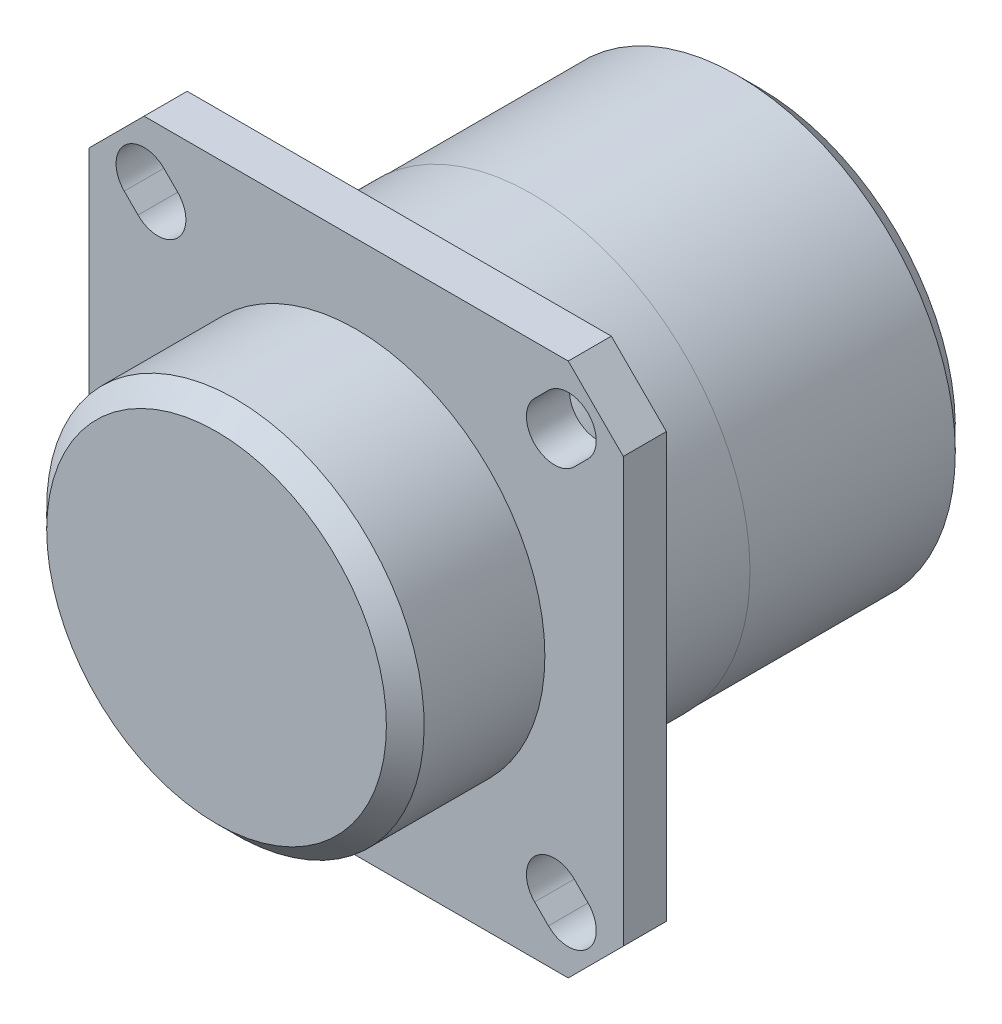
ISO-10303-21;
HEADER;
FILE_DESCRIPTION(('STEP AP214'),'2;1');
FILE_NAME('part.step','',(''),(''),'','','');
FILE_SCHEMA(('AUTOMOTIVE_DESIGN { 1 0 10303 214 1 1 1 1 }'));
ENDSEC;
DATA;
#1=APPLICATION_CONTEXT('core data for automotive mechanical design processes');
#2=APPLICATION_PROTOCOL_DEFINITION('international standard','automotive_design',2000,#1);
#3=PRODUCT_CONTEXT('',#1,'mechanical');
#4=PRODUCT('Part','Part','',(#3));
#5=PRODUCT_RELATED_PRODUCT_CATEGORY('part','',(#4));
#6=PRODUCT_DEFINITION_FORMATION('','',#4);
#7=PRODUCT_DEFINITION_CONTEXT('part definition',#1,'design');
#8=PRODUCT_DEFINITION('design','',#6,#7);
#9=PRODUCT_DEFINITION_SHAPE('','',#8);
#10=(LENGTH_UNIT() NAMED_UNIT(*) SI_UNIT(.MILLI.,.METRE.));
#11=(NAMED_UNIT(*) PLANE_ANGLE_UNIT() SI_UNIT($,.RADIAN.));
#12=(NAMED_UNIT(*) SI_UNIT($,.STERADIAN.) SOLID_ANGLE_UNIT());
#13=UNCERTAINTY_MEASURE_WITH_UNIT(LENGTH_MEASURE(1.E-05),#10,'distance_accuracy_value','');
#14=(GEOMETRIC_REPRESENTATION_CONTEXT(3) GLOBAL_UNCERTAINTY_ASSIGNED_CONTEXT((#13)) GLOBAL_UNIT_ASSIGNED_CONTEXT((#10,
#11,#12)) REPRESENTATION_CONTEXT('',''));
#15=CARTESIAN_POINT('',(0.,0.,0.));
#16=DIRECTION('',(0.,0.,1.));
#17=DIRECTION('',(1.,0.,0.));
#18=AXIS2_PLACEMENT_3D('',#15,#16,#17);
#19=CARTESIAN_POINT('',(0.,0.,0.));
#20=DIRECTION('',(0.,0.,1.));
#21=DIRECTION('',(1.,0.,0.));
#22=AXIS2_PLACEMENT_3D('',#19,#20,#21);
#23=PLANE('',#22);
#24=DIRECTION('',(-0.707106781186548,0.707106781186548,0.));
#25=VECTOR('',#24,1.);
#26=CARTESIAN_POINT('',(-12.305,-15.5,0.));
#27=LINE('',#26,#25);
#28=CARTESIAN_POINT('',(-12.305,-15.5,0.));
#29=VERTEX_POINT('',#28);
#30=CARTESIAN_POINT('',(-15.5,-12.305,0.));
#31=VERTEX_POINT('',#30);
#32=EDGE_CURVE('E9',#29,#31,#27,.T.);
#33=ORIENTED_EDGE('',*,*,#32,.T.);
#34=DIRECTION('',(0.,1.,0.));
#35=VECTOR('',#34,1.);
#36=CARTESIAN_POINT('',(-15.5,-12.305,0.));
#37=LINE('',#36,#35);
#38=CARTESIAN_POINT('',(-15.5,12.305,0.));
#39=VERTEX_POINT('',#38);
#40=EDGE_CURVE('E394',#31,#39,#37,.T.);
#41=ORIENTED_EDGE('',*,*,#40,.T.);
#42=DIRECTION('',(0.707106781186548,0.707106781186548,0.));
#43=VECTOR('',#42,1.);
#44=CARTESIAN_POINT('',(-15.5,12.305,0.));
#45=LINE('',#44,#43);
#46=CARTESIAN_POINT('',(-12.305,15.5,0.));
#47=VERTEX_POINT('',#46);
#48=EDGE_CURVE('E271',#39,#47,#45,.T.);
#49=ORIENTED_EDGE('',*,*,#48,.T.);
#50=DIRECTION('',(1.,0.,0.));
#51=VECTOR('',#50,1.);
#52=CARTESIAN_POINT('',(-12.305,15.5,0.));
#53=LINE('',#52,#51);
#54=CARTESIAN_POINT('',(12.305,15.5,0.));
#55=VERTEX_POINT('',#54);
#56=EDGE_CURVE('E258',#47,#55,#53,.T.);
#57=ORIENTED_EDGE('',*,*,#56,.T.);
#58=DIRECTION('',(0.707106781186548,-0.707106781186548,0.));
#59=VECTOR('',#58,1.);
#60=CARTESIAN_POINT('',(12.305,15.5,0.));
#61=LINE('',#60,#59);
#62=CARTESIAN_POINT('',(15.5,12.305,0.));
#63=VERTEX_POINT('',#62);
#64=EDGE_CURVE('E273',#55,#63,#61,.T.);
#65=ORIENTED_EDGE('',*,*,#64,.T.);
#66=DIRECTION('',(0.,-1.,0.));
#67=VECTOR('',#66,1.);
#68=CARTESIAN_POINT('',(15.5,12.305,0.));
#69=LINE('',#68,#67);
#70=CARTESIAN_POINT('',(15.5,-12.305,0.));
#71=VERTEX_POINT('',#70);
#72=EDGE_CURVE('E309',#63,#71,#69,.T.);
#73=ORIENTED_EDGE('',*,*,#72,.T.);
#74=DIRECTION('',(-0.707106781186548,-0.707106781186548,0.));
#75=VECTOR('',#74,1.);
#76=CARTESIAN_POINT('',(15.5,-12.305,0.));
#77=LINE('',#76,#75);
#78=CARTESIAN_POINT('',(12.305,-15.5,0.));
#79=VERTEX_POINT('',#78);
#80=EDGE_CURVE('E263',#71,#79,#77,.T.);
#81=ORIENTED_EDGE('',*,*,#80,.T.);
#82=DIRECTION('',(-1.,0.,0.));
#83=VECTOR('',#82,1.);
#84=CARTESIAN_POINT('',(12.305,-15.5,0.));
#85=LINE('',#84,#83);
#86=EDGE_CURVE('E288',#79,#29,#85,.T.);
#87=ORIENTED_EDGE('',*,*,#86,.T.);
#88=EDGE_LOOP('',(#33,#41,#49,#57,#65,#73,#81,#87));
#89=FACE_BOUND('',#88,.T.);
#90=DIRECTION('',(-0.707106781186548,-0.707106781186548,0.));
#91=VECTOR('',#90,1.);
#92=CARTESIAN_POINT('',(4.80345148057186,7.10154851942814,0.));
#93=LINE('',#92,#91);
#94=CARTESIAN_POINT('',(11.1559514805719,13.4540485194281,0.));
#95=VERTEX_POINT('',#94);
#96=CARTESIAN_POINT('',(10.3559514805719,12.6540485194281,0.));
#97=VERTEX_POINT('',#96);
#98=EDGE_CURVE('E221',#95,#97,#93,.T.);
#99=ORIENTED_EDGE('',*,*,#98,.T.);
#100=CARTESIAN_POINT('',(11.505,11.505,0.));
#101=DIRECTION('',(0.,0.,1.));
#102=DIRECTION('',(1.,0.,0.));
#103=AXIS2_PLACEMENT_3D('',#100,#101,#102);
#104=CIRCLE('',#103,1.625);
#105=CARTESIAN_POINT('',(12.6540485194281,10.3559514805719,0.));
#106=VERTEX_POINT('',#105);
#107=EDGE_CURVE('E229',#97,#106,#104,.T.);
#108=ORIENTED_EDGE('',*,*,#107,.T.);
#109=DIRECTION('',(0.707106781186548,0.707106781186548,0.));
#110=VECTOR('',#109,1.);
#111=CARTESIAN_POINT('',(7.10154851942814,4.80345148057186,0.));
#112=LINE('',#111,#110);
#113=CARTESIAN_POINT('',(13.4540485194281,11.1559514805719,0.));
#114=VERTEX_POINT('',#113);
#115=EDGE_CURVE('E295',#106,#114,#112,.T.);
#116=ORIENTED_EDGE('',*,*,#115,.T.);
#117=CARTESIAN_POINT('',(12.305,12.305,0.));
#118=DIRECTION('',(0.,0.,1.));
#119=DIRECTION('',(1.,0.,0.));
#120=AXIS2_PLACEMENT_3D('',#117,#118,#119);
#121=CIRCLE('',#120,1.625);
#122=EDGE_CURVE('E213',#114,#95,#121,.T.);
#123=ORIENTED_EDGE('',*,*,#122,.T.);
#124=EDGE_LOOP('',(#99,#108,#116,#123));
#125=FACE_BOUND('',#124,.T.);
#126=DIRECTION('',(0.707106781186548,-0.707106781186548,0.));
#127=VECTOR('',#126,1.);
#128=CARTESIAN_POINT('',(-7.10154851942814,4.80345148057186,0.));
#129=LINE('',#128,#127);
#130=CARTESIAN_POINT('',(-13.4540485194281,11.1559514805719,0.));
#131=VERTEX_POINT('',#130);
#132=CARTESIAN_POINT('',(-12.6540485194281,10.3559514805719,0.));
#133=VERTEX_POINT('',#132);
#134=EDGE_CURVE('E343',#131,#133,#129,.T.);
#135=ORIENTED_EDGE('',*,*,#134,.T.);
#136=CARTESIAN_POINT('',(-11.505,11.505,0.));
#137=DIRECTION('',(0.,0.,1.));
#138=DIRECTION('',(0.,1.,0.));
#139=AXIS2_PLACEMENT_3D('',#136,#137,#138);
#140=CIRCLE('',#139,1.625);
#141=CARTESIAN_POINT('',(-10.3559514805719,12.6540485194281,0.));
#142=VERTEX_POINT('',#141);
#143=EDGE_CURVE('E243',#133,#142,#140,.T.);
#144=ORIENTED_EDGE('',*,*,#143,.T.);
#145=DIRECTION('',(-0.707106781186548,0.707106781186548,0.));
#146=VECTOR('',#145,1.);
#147=CARTESIAN_POINT('',(-4.80345148057186,7.10154851942814,0.));
#148=LINE('',#147,#146);
#149=CARTESIAN_POINT('',(-11.1559514805719,13.4540485194281,0.));
#150=VERTEX_POINT('',#149);
#151=EDGE_CURVE('E235',#142,#150,#148,.T.);
#152=ORIENTED_EDGE('',*,*,#151,.T.);
#153=CARTESIAN_POINT('',(-12.305,12.305,0.));
#154=DIRECTION('',(0.,0.,1.));
#155=DIRECTION('',(0.,1.,0.));
#156=AXIS2_PLACEMENT_3D('',#153,#154,#155);
#157=CIRCLE('',#156,1.625);
#158=EDGE_CURVE('E323',#150,#131,#157,.T.);
#159=ORIENTED_EDGE('',*,*,#158,.T.);
#160=EDGE_LOOP('',(#135,#144,#152,#159));
#161=FACE_BOUND('',#160,.T.);
#162=DIRECTION('',(0.707106781186548,0.707106781186548,0.));
#163=VECTOR('',#162,1.);
#164=CARTESIAN_POINT('',(-4.80345148057186,-7.10154851942814,0.));
#165=LINE('',#164,#163);
#166=CARTESIAN_POINT('',(-11.1559514805719,-13.4540485194281,0.));
#167=VERTEX_POINT('',#166);
#168=CARTESIAN_POINT('',(-10.3559514805719,-12.6540485194281,0.));
#169=VERTEX_POINT('',#168);
#170=EDGE_CURVE('E290',#167,#169,#165,.T.);
#171=ORIENTED_EDGE('',*,*,#170,.T.);
#172=CARTESIAN_POINT('',(-11.505,-11.505,0.));
#173=DIRECTION('',(0.,0.,1.));
#174=DIRECTION('',(-1.,0.,0.));
#175=AXIS2_PLACEMENT_3D('',#172,#173,#174);
#176=CIRCLE('',#175,1.625);
#177=CARTESIAN_POINT('',(-12.6540485194281,-10.3559514805719,0.));
#178=VERTEX_POINT('',#177);
#179=EDGE_CURVE('E320',#169,#178,#176,.T.);
#180=ORIENTED_EDGE('',*,*,#179,.T.);
#181=DIRECTION('',(-0.707106781186548,-0.707106781186547,0.));
#182=VECTOR('',#181,1.);
#183=CARTESIAN_POINT('',(-7.10154851942814,-4.80345148057186,0.));
#184=LINE('',#183,#182);
#185=CARTESIAN_POINT('',(-13.4540485194281,-11.1559514805719,0.));
#186=VERTEX_POINT('',#185);
#187=EDGE_CURVE('E280',#178,#186,#184,.T.);
#188=ORIENTED_EDGE('',*,*,#187,.T.);
#189=CARTESIAN_POINT('',(-12.305,-12.305,0.));
#190=DIRECTION('',(0.,0.,1.));
#191=DIRECTION('',(-1.,0.,0.));
#192=AXIS2_PLACEMENT_3D('',#189,#190,#191);
#193=CIRCLE('',#192,1.625);
#194=EDGE_CURVE('E19',#186,#167,#193,.T.);
#195=ORIENTED_EDGE('',*,*,#194,.T.);
#196=EDGE_LOOP('',(#171,#180,#188,#195));
#197=FACE_BOUND('',#196,.T.);
#198=DIRECTION('',(-0.707106781186548,0.707106781186548,0.));
#199=VECTOR('',#198,1.);
#200=CARTESIAN_POINT('',(7.10154851942814,-4.80345148057186,0.));
#201=LINE('',#200,#199);
#202=CARTESIAN_POINT('',(13.4540485194281,-11.1559514805719,0.));
#203=VERTEX_POINT('',#202);
#204=CARTESIAN_POINT('',(12.6540485194281,-10.3559514805719,0.));
#205=VERTEX_POINT('',#204);
#206=EDGE_CURVE('E371',#203,#205,#201,.T.);
#207=ORIENTED_EDGE('',*,*,#206,.T.);
#208=CARTESIAN_POINT('',(11.505,-11.505,0.));
#209=DIRECTION('',(0.,0.,1.));
#210=DIRECTION('',(0.,-1.,0.));
#211=AXIS2_PLACEMENT_3D('',#208,#209,#210);
#212=CIRCLE('',#211,1.625);
#213=CARTESIAN_POINT('',(10.3559514805719,-12.6540485194281,0.));
#214=VERTEX_POINT('',#213);
#215=EDGE_CURVE('E251',#205,#214,#212,.T.);
#216=ORIENTED_EDGE('',*,*,#215,.T.);
#217=DIRECTION('',(0.707106781186547,-0.707106781186548,0.));
#218=VECTOR('',#217,1.);
#219=CARTESIAN_POINT('',(4.80345148057186,-7.10154851942814,0.));
#220=LINE('',#219,#218);
#221=CARTESIAN_POINT('',(11.1559514805719,-13.4540485194281,0.));
#222=VERTEX_POINT('',#221);
#223=EDGE_CURVE('E327',#214,#222,#220,.T.);
#224=ORIENTED_EDGE('',*,*,#223,.T.);
#225=CARTESIAN_POINT('',(12.305,-12.305,0.));
#226=DIRECTION('',(0.,0.,1.));
#227=DIRECTION('',(0.,-1.,0.));
#228=AXIS2_PLACEMENT_3D('',#225,#226,#227);
#229=CIRCLE('',#228,1.625);
#230=EDGE_CURVE('E333',#222,#203,#229,.T.);
#231=ORIENTED_EDGE('',*,*,#230,.T.);
#232=EDGE_LOOP('',(#207,#216,#224,#231));
#233=FACE_BOUND('',#232,.T.);
#234=CARTESIAN_POINT('',(0.,0.,0.));
#235=DIRECTION('',(0.,0.,1.));
#236=DIRECTION('',(0.,1.,0.));
#237=AXIS2_PLACEMENT_3D('',#234,#235,#236);
#238=CIRCLE('',#237,12.65025);
#239=CARTESIAN_POINT('',(0.,-12.65025,0.));
#240=VERTEX_POINT('',#239);
#241=EDGE_CURVE('E304',#240,#240,#238,.T.);
#242=ORIENTED_EDGE('',*,*,#241,.T.);
#243=EDGE_LOOP('',(#242));
#244=FACE_BOUND('',#243,.T.);
#245=ADVANCED_FACE('F15',(#89,#125,#161,#197,#233,#244),#23,.F.);
#246=CARTESIAN_POINT('',(0.,0.,2.5));
#247=DIRECTION('',(0.,0.,1.));
#248=DIRECTION('',(1.,0.,0.));
#249=AXIS2_PLACEMENT_3D('',#246,#247,#248);
#250=PLANE('',#249);
#251=DIRECTION('',(0.,1.,0.));
#252=VECTOR('',#251,1.);
#253=CARTESIAN_POINT('',(-15.5,-12.305,2.5));
#254=LINE('',#253,#252);
#255=CARTESIAN_POINT('',(-15.5,-12.305,2.5));
#256=VERTEX_POINT('',#255);
#257=CARTESIAN_POINT('',(-15.5,12.305,2.5));
#258=VERTEX_POINT('',#257);
#259=EDGE_CURVE('E286',#256,#258,#254,.T.);
#260=ORIENTED_EDGE('',*,*,#259,.F.);
#261=DIRECTION('',(-0.707106781186548,0.707106781186548,0.));
#262=VECTOR('',#261,1.);
#263=CARTESIAN_POINT('',(-12.305,-15.5,2.5));
#264=LINE('',#263,#262);
#265=CARTESIAN_POINT('',(-12.305,-15.5,2.5));
#266=VERTEX_POINT('',#265);
#267=EDGE_CURVE('E25',#266,#256,#264,.T.);
#268=ORIENTED_EDGE('',*,*,#267,.F.);
#269=DIRECTION('',(-1.,0.,0.));
#270=VECTOR('',#269,1.);
#271=CARTESIAN_POINT('',(12.305,-15.5,2.5));
#272=LINE('',#271,#270);
#273=CARTESIAN_POINT('',(12.305,-15.5,2.5));
#274=VERTEX_POINT('',#273);
#275=EDGE_CURVE('E266',#274,#266,#272,.T.);
#276=ORIENTED_EDGE('',*,*,#275,.F.);
#277=DIRECTION('',(-0.707106781186548,-0.707106781186548,0.));
#278=VECTOR('',#277,1.);
#279=CARTESIAN_POINT('',(15.5,-12.305,2.5));
#280=LINE('',#279,#278);
#281=CARTESIAN_POINT('',(15.5,-12.305,2.5));
#282=VERTEX_POINT('',#281);
#283=EDGE_CURVE('E306',#282,#274,#280,.T.);
#284=ORIENTED_EDGE('',*,*,#283,.F.);
#285=DIRECTION('',(0.,-1.,0.));
#286=VECTOR('',#285,1.);
#287=CARTESIAN_POINT('',(15.5,12.305,2.5));
#288=LINE('',#287,#286);
#289=CARTESIAN_POINT('',(15.5,12.305,2.5));
#290=VERTEX_POINT('',#289);
#291=EDGE_CURVE('E276',#290,#282,#288,.T.);
#292=ORIENTED_EDGE('',*,*,#291,.F.);
#293=DIRECTION('',(0.707106781186548,-0.707106781186548,0.));
#294=VECTOR('',#293,1.);
#295=CARTESIAN_POINT('',(12.305,15.5,2.5));
#296=LINE('',#295,#294);
#297=CARTESIAN_POINT('',(12.305,15.5,2.5));
#298=VERTEX_POINT('',#297);
#299=EDGE_CURVE('E262',#298,#290,#296,.T.);
#300=ORIENTED_EDGE('',*,*,#299,.F.);
#301=DIRECTION('',(1.,0.,0.));
#302=VECTOR('',#301,1.);
#303=CARTESIAN_POINT('',(-12.305,15.5,2.5));
#304=LINE('',#303,#302);
#305=CARTESIAN_POINT('',(-12.305,15.5,2.5));
#306=VERTEX_POINT('',#305);
#307=EDGE_CURVE('E259',#306,#298,#304,.T.);
#308=ORIENTED_EDGE('',*,*,#307,.F.);
#309=DIRECTION('',(0.707106781186548,0.707106781186548,0.));
#310=VECTOR('',#309,1.);
#311=CARTESIAN_POINT('',(-15.5,12.305,2.5));
#312=LINE('',#311,#310);
#313=EDGE_CURVE('E272',#258,#306,#312,.T.);
#314=ORIENTED_EDGE('',*,*,#313,.F.);
#315=EDGE_LOOP('',(#260,#268,#276,#284,#292,#300,#308,#314));
#316=FACE_BOUND('',#315,.T.);
#317=DIRECTION('',(0.707106781186548,0.707106781186548,0.));
#318=VECTOR('',#317,1.);
#319=CARTESIAN_POINT('',(4.80345148057186,7.10154851942814,2.5));
#320=LINE('',#319,#318);
#321=CARTESIAN_POINT('',(10.3559514805719,12.6540485194281,2.5));
#322=VERTEX_POINT('',#321);
#323=CARTESIAN_POINT('',(11.1559514805719,13.4540485194281,2.5));
#324=VERTEX_POINT('',#323);
#325=EDGE_CURVE('E219',#322,#324,#320,.T.);
#326=ORIENTED_EDGE('',*,*,#325,.T.);
#327=CARTESIAN_POINT('',(12.305,12.305,2.5));
#328=DIRECTION('',(0.,0.,-1.));
#329=DIRECTION('',(1.,0.,0.));
#330=AXIS2_PLACEMENT_3D('',#327,#328,#329);
#331=CIRCLE('',#330,1.625);
#332=CARTESIAN_POINT('',(13.4540485194281,11.1559514805719,2.5));
#333=VERTEX_POINT('',#332);
#334=EDGE_CURVE('E201',#324,#333,#331,.T.);
#335=ORIENTED_EDGE('',*,*,#334,.T.);
#336=DIRECTION('',(-0.707106781186548,-0.707106781186548,0.));
#337=VECTOR('',#336,1.);
#338=CARTESIAN_POINT('',(7.10154851942814,4.80345148057186,2.5));
#339=LINE('',#338,#337);
#340=CARTESIAN_POINT('',(12.6540485194281,10.3559514805719,2.5));
#341=VERTEX_POINT('',#340);
#342=EDGE_CURVE('E330',#333,#341,#339,.T.);
#343=ORIENTED_EDGE('',*,*,#342,.T.);
#344=CARTESIAN_POINT('',(11.505,11.505,2.5));
#345=DIRECTION('',(0.,0.,-1.));
#346=DIRECTION('',(1.,0.,0.));
#347=AXIS2_PLACEMENT_3D('',#344,#345,#346);
#348=CIRCLE('',#347,1.625);
#349=EDGE_CURVE('E225',#341,#322,#348,.T.);
#350=ORIENTED_EDGE('',*,*,#349,.T.);
#351=EDGE_LOOP('',(#326,#335,#343,#350));
#352=FACE_BOUND('',#351,.T.);
#353=DIRECTION('',(-0.707106781186548,0.707106781186548,0.));
#354=VECTOR('',#353,1.);
#355=CARTESIAN_POINT('',(-7.10154851942814,4.80345148057186,2.5));
#356=LINE('',#355,#354);
#357=CARTESIAN_POINT('',(-12.6540485194281,10.3559514805719,2.5));
#358=VERTEX_POINT('',#357);
#359=CARTESIAN_POINT('',(-13.4540485194281,11.1559514805719,2.5));
#360=VERTEX_POINT('',#359);
#361=EDGE_CURVE('E342',#358,#360,#356,.T.);
#362=ORIENTED_EDGE('',*,*,#361,.T.);
#363=CARTESIAN_POINT('',(-12.305,12.305,2.5));
#364=DIRECTION('',(0.,0.,-1.));
#365=DIRECTION('',(0.,1.,0.));
#366=AXIS2_PLACEMENT_3D('',#363,#364,#365);
#367=CIRCLE('',#366,1.625);
#368=CARTESIAN_POINT('',(-11.1559514805719,13.4540485194281,2.5));
#369=VERTEX_POINT('',#368);
#370=EDGE_CURVE('E96',#360,#369,#367,.T.);
#371=ORIENTED_EDGE('',*,*,#370,.T.);
#372=DIRECTION('',(0.707106781186548,-0.707106781186548,0.));
#373=VECTOR('',#372,1.);
#374=CARTESIAN_POINT('',(-4.80345148057186,7.10154851942814,2.5));
#375=LINE('',#374,#373);
#376=CARTESIAN_POINT('',(-10.3559514805719,12.6540485194281,2.5));
#377=VERTEX_POINT('',#376);
#378=EDGE_CURVE('E364',#369,#377,#375,.T.);
#379=ORIENTED_EDGE('',*,*,#378,.T.);
#380=CARTESIAN_POINT('',(-11.505,11.505,2.5));
#381=DIRECTION('',(0.,0.,-1.));
#382=DIRECTION('',(0.,1.,0.));
#383=AXIS2_PLACEMENT_3D('',#380,#381,#382);
#384=CIRCLE('',#383,1.625);
#385=EDGE_CURVE('E240',#377,#358,#384,.T.);
#386=ORIENTED_EDGE('',*,*,#385,.T.);
#387=EDGE_LOOP('',(#362,#371,#379,#386));
#388=FACE_BOUND('',#387,.T.);
#389=DIRECTION('',(-0.707106781186548,-0.707106781186548,0.));
#390=VECTOR('',#389,1.);
#391=CARTESIAN_POINT('',(-4.80345148057186,-7.10154851942814,2.5));
#392=LINE('',#391,#390);
#393=CARTESIAN_POINT('',(-10.3559514805719,-12.6540485194281,2.5));
#394=VERTEX_POINT('',#393);
#395=CARTESIAN_POINT('',(-11.1559514805719,-13.4540485194281,2.5));
#396=VERTEX_POINT('',#395);
#397=EDGE_CURVE('E289',#394,#396,#392,.T.);
#398=ORIENTED_EDGE('',*,*,#397,.T.);
#399=CARTESIAN_POINT('',(-12.305,-12.305,2.5));
#400=DIRECTION('',(0.,0.,-1.));
#401=DIRECTION('',(-1.,0.,0.));
#402=AXIS2_PLACEMENT_3D('',#399,#400,#401);
#403=CIRCLE('',#402,1.625);
#404=CARTESIAN_POINT('',(-13.4540485194281,-11.1559514805719,2.5));
#405=VERTEX_POINT('',#404);
#406=EDGE_CURVE('E160',#396,#405,#403,.T.);
#407=ORIENTED_EDGE('',*,*,#406,.T.);
#408=DIRECTION('',(0.707106781186548,0.707106781186547,0.));
#409=VECTOR('',#408,1.);
#410=CARTESIAN_POINT('',(-7.10154851942814,-4.80345148057186,2.5));
#411=LINE('',#410,#409);
#412=CARTESIAN_POINT('',(-12.6540485194281,-10.3559514805719,2.5));
#413=VERTEX_POINT('',#412);
#414=EDGE_CURVE('E281',#405,#413,#411,.T.);
#415=ORIENTED_EDGE('',*,*,#414,.T.);
#416=CARTESIAN_POINT('',(-11.505,-11.505,2.5));
#417=DIRECTION('',(0.,0.,-1.));
#418=DIRECTION('',(-1.,0.,0.));
#419=AXIS2_PLACEMENT_3D('',#416,#417,#418);
#420=CIRCLE('',#419,1.625);
#421=EDGE_CURVE('E151',#413,#394,#420,.T.);
#422=ORIENTED_EDGE('',*,*,#421,.T.);
#423=EDGE_LOOP('',(#398,#407,#415,#422));
#424=FACE_BOUND('',#423,.T.);
#425=DIRECTION('',(0.707106781186548,-0.707106781186548,0.));
#426=VECTOR('',#425,1.);
#427=CARTESIAN_POINT('',(7.10154851942814,-4.80345148057186,2.5));
#428=LINE('',#427,#426);
#429=CARTESIAN_POINT('',(12.6540485194281,-10.3559514805719,2.5));
#430=VERTEX_POINT('',#429);
#431=CARTESIAN_POINT('',(13.4540485194281,-11.1559514805719,2.5));
#432=VERTEX_POINT('',#431);
#433=EDGE_CURVE('E368',#430,#432,#428,.T.);
#434=ORIENTED_EDGE('',*,*,#433,.T.);
#435=CARTESIAN_POINT('',(12.305,-12.305,2.5));
#436=DIRECTION('',(0.,0.,-1.));
#437=DIRECTION('',(0.,-1.,0.));
#438=AXIS2_PLACEMENT_3D('',#435,#436,#437);
#439=CIRCLE('',#438,1.625);
#440=CARTESIAN_POINT('',(11.1559514805719,-13.4540485194281,2.5));
#441=VERTEX_POINT('',#440);
#442=EDGE_CURVE('E335',#432,#441,#439,.T.);
#443=ORIENTED_EDGE('',*,*,#442,.T.);
#444=DIRECTION('',(-0.707106781186547,0.707106781186548,0.));
#445=VECTOR('',#444,1.);
#446=CARTESIAN_POINT('',(4.80345148057186,-7.10154851942814,2.5));
#447=LINE('',#446,#445);
#448=CARTESIAN_POINT('',(10.3559514805719,-12.6540485194281,2.5));
#449=VERTEX_POINT('',#448);
#450=EDGE_CURVE('E315',#441,#449,#447,.T.);
#451=ORIENTED_EDGE('',*,*,#450,.T.);
#452=CARTESIAN_POINT('',(11.505,-11.505,2.5));
#453=DIRECTION('',(0.,0.,-1.));
#454=DIRECTION('',(0.,-1.,0.));
#455=AXIS2_PLACEMENT_3D('',#452,#453,#454);
#456=CIRCLE('',#455,1.625);
#457=EDGE_CURVE('E254',#449,#430,#456,.T.);
#458=ORIENTED_EDGE('',*,*,#457,.T.);
#459=EDGE_LOOP('',(#434,#443,#451,#458));
#460=FACE_BOUND('',#459,.T.);
#461=CARTESIAN_POINT('',(0.,0.,2.5));
#462=DIRECTION('',(0.,0.,-1.));
#463=DIRECTION('',(0.,1.,0.));
#464=AXIS2_PLACEMENT_3D('',#461,#462,#463);
#465=CIRCLE('',#464,10.95);
#466=CARTESIAN_POINT('',(0.,-10.95,2.5));
#467=VERTEX_POINT('',#466);
#468=EDGE_CURVE('E244',#467,#467,#465,.T.);
#469=ORIENTED_EDGE('',*,*,#468,.T.);
#470=EDGE_LOOP('',(#469));
#471=FACE_BOUND('',#470,.T.);
#472=ADVANCED_FACE('F224',(#316,#352,#388,#424,#460,#471),#250,.T.);
#473=CARTESIAN_POINT('',(-13.9025,-13.9025,0.));
#474=DIRECTION('',(-0.707106781186548,-0.707106781186548,0.));
#475=DIRECTION('',(0.707106781186548,-0.707106781186548,0.));
#476=AXIS2_PLACEMENT_3D('',#473,#474,#475);
#477=PLANE('',#476);
#478=ORIENTED_EDGE('',*,*,#267,.T.);
#479=DIRECTION('',(0.,0.,1.));
#480=VECTOR('',#479,1.);
#481=CARTESIAN_POINT('',(-15.5,-12.305,0.));
#482=LINE('',#481,#480);
#483=EDGE_CURVE('E374',#31,#256,#482,.T.);
#484=ORIENTED_EDGE('',*,*,#483,.F.);
#485=ORIENTED_EDGE('',*,*,#32,.F.);
#486=DIRECTION('',(0.,0.,1.));
#487=VECTOR('',#486,1.);
#488=CARTESIAN_POINT('',(-12.305,-15.5,0.));
#489=LINE('',#488,#487);
#490=EDGE_CURVE('E312',#29,#266,#489,.T.);
#491=ORIENTED_EDGE('',*,*,#490,.T.);
#492=EDGE_LOOP('',(#478,#484,#485,#491));
#493=FACE_BOUND('',#492,.T.);
#494=ADVANCED_FACE('F485',(#493),#477,.T.);
#495=CARTESIAN_POINT('',(0.,-15.5,0.));
#496=DIRECTION('',(0.,-1.,0.));
#497=DIRECTION('',(1.,0.,0.));
#498=AXIS2_PLACEMENT_3D('',#495,#496,#497);
#499=PLANE('',#498);
#500=ORIENTED_EDGE('',*,*,#275,.T.);
#501=ORIENTED_EDGE('',*,*,#490,.F.);
#502=ORIENTED_EDGE('',*,*,#86,.F.);
#503=DIRECTION('',(0.,0.,1.));
#504=VECTOR('',#503,1.);
#505=CARTESIAN_POINT('',(12.305,-15.5,0.));
#506=LINE('',#505,#504);
#507=EDGE_CURVE('E267',#79,#274,#506,.T.);
#508=ORIENTED_EDGE('',*,*,#507,.T.);
#509=EDGE_LOOP('',(#500,#501,#502,#508));
#510=FACE_BOUND('',#509,.T.);
#511=ADVANCED_FACE('F442',(#510),#499,.T.);
#512=CARTESIAN_POINT('',(13.9025,-13.9025,0.));
#513=DIRECTION('',(0.707106781186548,-0.707106781186548,0.));
#514=DIRECTION('',(0.707106781186548,0.707106781186548,0.));
#515=AXIS2_PLACEMENT_3D('',#512,#513,#514);
#516=PLANE('',#515);
#517=ORIENTED_EDGE('',*,*,#283,.T.);
#518=ORIENTED_EDGE('',*,*,#507,.F.);
#519=ORIENTED_EDGE('',*,*,#80,.F.);
#520=DIRECTION('',(0.,0.,1.));
#521=VECTOR('',#520,1.);
#522=CARTESIAN_POINT('',(15.5,-12.305,0.));
#523=LINE('',#522,#521);
#524=EDGE_CURVE('E338',#71,#282,#523,.T.);
#525=ORIENTED_EDGE('',*,*,#524,.T.);
#526=EDGE_LOOP('',(#517,#518,#519,#525));
#527=FACE_BOUND('',#526,.T.);
#528=ADVANCED_FACE('F432',(#527),#516,.T.);
#529=CARTESIAN_POINT('',(15.5,0.,0.));
#530=DIRECTION('',(1.,0.,0.));
#531=DIRECTION('',(0.,1.,0.));
#532=AXIS2_PLACEMENT_3D('',#529,#530,#531);
#533=PLANE('',#532);
#534=ORIENTED_EDGE('',*,*,#291,.T.);
#535=ORIENTED_EDGE('',*,*,#524,.F.);
#536=ORIENTED_EDGE('',*,*,#72,.F.);
#537=DIRECTION('',(0.,0.,1.));
#538=VECTOR('',#537,1.);
#539=CARTESIAN_POINT('',(15.5,12.305,0.));
#540=LINE('',#539,#538);
#541=EDGE_CURVE('E277',#63,#290,#540,.T.);
#542=ORIENTED_EDGE('',*,*,#541,.T.);
#543=EDGE_LOOP('',(#534,#535,#536,#542));
#544=FACE_BOUND('',#543,.T.);
#545=ADVANCED_FACE('F435',(#544),#533,.T.);
#546=CARTESIAN_POINT('',(13.9025,13.9025,0.));
#547=DIRECTION('',(0.707106781186548,0.707106781186548,0.));
#548=DIRECTION('',(-0.707106781186548,0.707106781186548,0.));
#549=AXIS2_PLACEMENT_3D('',#546,#547,#548);
#550=PLANE('',#549);
#551=ORIENTED_EDGE('',*,*,#299,.T.);
#552=ORIENTED_EDGE('',*,*,#541,.F.);
#553=ORIENTED_EDGE('',*,*,#64,.F.);
#554=DIRECTION('',(0.,0.,1.));
#555=VECTOR('',#554,1.);
#556=CARTESIAN_POINT('',(12.305,15.5,0.));
#557=LINE('',#556,#555);
#558=EDGE_CURVE('E255',#55,#298,#557,.T.);
#559=ORIENTED_EDGE('',*,*,#558,.T.);
#560=EDGE_LOOP('',(#551,#552,#553,#559));
#561=FACE_BOUND('',#560,.T.);
#562=ADVANCED_FACE('F448',(#561),#550,.T.);
#563=CARTESIAN_POINT('',(0.,15.5,0.));
#564=DIRECTION('',(0.,1.,0.));
#565=DIRECTION('',(-1.,0.,0.));
#566=AXIS2_PLACEMENT_3D('',#563,#564,#565);
#567=PLANE('',#566);
#568=ORIENTED_EDGE('',*,*,#307,.T.);
#569=ORIENTED_EDGE('',*,*,#558,.F.);
#570=ORIENTED_EDGE('',*,*,#56,.F.);
#571=DIRECTION('',(0.,0.,1.));
#572=VECTOR('',#571,1.);
#573=CARTESIAN_POINT('',(-12.305,15.5,0.));
#574=LINE('',#573,#572);
#575=EDGE_CURVE('E268',#47,#306,#574,.T.);
#576=ORIENTED_EDGE('',*,*,#575,.T.);
#577=EDGE_LOOP('',(#568,#569,#570,#576));
#578=FACE_BOUND('',#577,.T.);
#579=ADVANCED_FACE('F450',(#578),#567,.T.);
#580=CARTESIAN_POINT('',(-13.9025,13.9025,0.));
#581=DIRECTION('',(-0.707106781186548,0.707106781186548,0.));
#582=DIRECTION('',(-0.707106781186548,-0.707106781186548,0.));
#583=AXIS2_PLACEMENT_3D('',#580,#581,#582);
#584=PLANE('',#583);
#585=ORIENTED_EDGE('',*,*,#313,.T.);
#586=ORIENTED_EDGE('',*,*,#575,.F.);
#587=ORIENTED_EDGE('',*,*,#48,.F.);
#588=DIRECTION('',(0.,0.,1.));
#589=VECTOR('',#588,1.);
#590=CARTESIAN_POINT('',(-15.5,12.305,0.));
#591=LINE('',#590,#589);
#592=EDGE_CURVE('E402',#39,#258,#591,.T.);
#593=ORIENTED_EDGE('',*,*,#592,.T.);
#594=EDGE_LOOP('',(#585,#586,#587,#593));
#595=FACE_BOUND('',#594,.T.);
#596=ADVANCED_FACE('F515',(#595),#584,.T.);
#597=CARTESIAN_POINT('',(-15.5,0.,0.));
#598=DIRECTION('',(-1.,0.,0.));
#599=DIRECTION('',(0.,-1.,0.));
#600=AXIS2_PLACEMENT_3D('',#597,#598,#599);
#601=PLANE('',#600);
#602=ORIENTED_EDGE('',*,*,#259,.T.);
#603=ORIENTED_EDGE('',*,*,#592,.F.);
#604=ORIENTED_EDGE('',*,*,#40,.F.);
#605=ORIENTED_EDGE('',*,*,#483,.T.);
#606=EDGE_LOOP('',(#602,#603,#604,#605));
#607=FACE_BOUND('',#606,.T.);
#608=ADVANCED_FACE('F17',(#607),#601,.T.);
#609=CARTESIAN_POINT('',(12.305,12.305,-2.5));
#610=DIRECTION('',(0.,0.,-1.));
#611=DIRECTION('',(1.,0.,0.));
#612=AXIS2_PLACEMENT_3D('',#609,#610,#611);
#613=CYLINDRICAL_SURFACE('',#612,1.625);
#614=ORIENTED_EDGE('',*,*,#334,.F.);
#615=DIRECTION('',(0.,0.,1.));
#616=VECTOR('',#615,1.);
#617=CARTESIAN_POINT('',(11.1559514805719,13.4540485194281,-2.5));
#618=LINE('',#617,#616);
#619=EDGE_CURVE('E205',#95,#324,#618,.T.);
#620=ORIENTED_EDGE('',*,*,#619,.F.);
#621=ORIENTED_EDGE('',*,*,#122,.F.);
#622=DIRECTION('',(0.,0.,1.));
#623=VECTOR('',#622,1.);
#624=CARTESIAN_POINT('',(13.4540485194281,11.1559514805719,-2.5));
#625=LINE('',#624,#623);
#626=EDGE_CURVE('E208',#114,#333,#625,.T.);
#627=ORIENTED_EDGE('',*,*,#626,.T.);
#628=EDGE_LOOP('',(#614,#620,#621,#627));
#629=FACE_BOUND('',#628,.T.);
#630=ADVANCED_FACE('F203',(#629),#613,.F.);
#631=CARTESIAN_POINT('',(10.7559514805719,13.0540485194281,-2.5));
#632=DIRECTION('',(-0.707106781186548,0.707106781186548,0.));
#633=DIRECTION('',(-0.707106781186548,-0.707106781186548,0.));
#634=AXIS2_PLACEMENT_3D('',#631,#632,#633);
#635=PLANE('',#634);
#636=ORIENTED_EDGE('',*,*,#325,.F.);
#637=DIRECTION('',(0.,0.,1.));
#638=VECTOR('',#637,1.);
#639=CARTESIAN_POINT('',(10.3559514805719,12.6540485194281,-2.5));
#640=LINE('',#639,#638);
#641=EDGE_CURVE('E226',#97,#322,#640,.T.);
#642=ORIENTED_EDGE('',*,*,#641,.F.);
#643=ORIENTED_EDGE('',*,*,#98,.F.);
#644=ORIENTED_EDGE('',*,*,#619,.T.);
#645=EDGE_LOOP('',(#636,#642,#643,#644));
#646=FACE_BOUND('',#645,.T.);
#647=ADVANCED_FACE('F217',(#646),#635,.F.);
#648=CARTESIAN_POINT('',(11.505,11.505,-2.5));
#649=DIRECTION('',(0.,0.,-1.));
#650=DIRECTION('',(1.,0.,0.));
#651=AXIS2_PLACEMENT_3D('',#648,#649,#650);
#652=CYLINDRICAL_SURFACE('',#651,1.625);
#653=ORIENTED_EDGE('',*,*,#349,.F.);
#654=DIRECTION('',(0.,0.,1.));
#655=VECTOR('',#654,1.);
#656=CARTESIAN_POINT('',(12.6540485194281,10.3559514805719,-2.5));
#657=LINE('',#656,#655);
#658=EDGE_CURVE('E292',#106,#341,#657,.T.);
#659=ORIENTED_EDGE('',*,*,#658,.F.);
#660=ORIENTED_EDGE('',*,*,#107,.F.);
#661=ORIENTED_EDGE('',*,*,#641,.T.);
#662=EDGE_LOOP('',(#653,#659,#660,#661));
#663=FACE_BOUND('',#662,.T.);
#664=ADVANCED_FACE('F560',(#663),#652,.F.);
#665=CARTESIAN_POINT('',(13.0540485194281,10.7559514805719,-2.5));
#666=DIRECTION('',(0.707106781186548,-0.707106781186548,0.));
#667=DIRECTION('',(0.707106781186548,0.707106781186548,0.));
#668=AXIS2_PLACEMENT_3D('',#665,#666,#667);
#669=PLANE('',#668);
#670=ORIENTED_EDGE('',*,*,#342,.F.);
#671=ORIENTED_EDGE('',*,*,#626,.F.);
#672=ORIENTED_EDGE('',*,*,#115,.F.);
#673=ORIENTED_EDGE('',*,*,#658,.T.);
#674=EDGE_LOOP('',(#670,#671,#672,#673));
#675=FACE_BOUND('',#674,.T.);
#676=ADVANCED_FACE('F712',(#675),#669,.F.);
#677=CARTESIAN_POINT('',(-12.305,12.305,-2.5));
#678=DIRECTION('',(0.,0.,-1.));
#679=DIRECTION('',(0.,1.,0.));
#680=AXIS2_PLACEMENT_3D('',#677,#678,#679);
#681=CYLINDRICAL_SURFACE('',#680,1.625);
#682=ORIENTED_EDGE('',*,*,#370,.F.);
#683=DIRECTION('',(0.,0.,1.));
#684=VECTOR('',#683,1.);
#685=CARTESIAN_POINT('',(-13.4540485194281,11.1559514805719,-2.5));
#686=LINE('',#685,#684);
#687=EDGE_CURVE('E324',#131,#360,#686,.T.);
#688=ORIENTED_EDGE('',*,*,#687,.F.);
#689=ORIENTED_EDGE('',*,*,#158,.F.);
#690=DIRECTION('',(0.,0.,1.));
#691=VECTOR('',#690,1.);
#692=CARTESIAN_POINT('',(-11.1559514805719,13.4540485194281,-2.5));
#693=LINE('',#692,#691);
#694=EDGE_CURVE('E239',#150,#369,#693,.T.);
#695=ORIENTED_EDGE('',*,*,#694,.T.);
#696=EDGE_LOOP('',(#682,#688,#689,#695));
#697=FACE_BOUND('',#696,.T.);
#698=ADVANCED_FACE('F567',(#697),#681,.F.);
#699=CARTESIAN_POINT('',(-13.0540485194281,10.7559514805719,-2.5));
#700=DIRECTION('',(-0.707106781186548,-0.707106781186548,0.));
#701=DIRECTION('',(0.707106781186548,-0.707106781186548,0.));
#702=AXIS2_PLACEMENT_3D('',#699,#700,#701);
#703=PLANE('',#702);
#704=ORIENTED_EDGE('',*,*,#361,.F.);
#705=DIRECTION('',(0.,0.,1.));
#706=VECTOR('',#705,1.);
#707=CARTESIAN_POINT('',(-12.6540485194281,10.3559514805719,-2.5));
#708=LINE('',#707,#706);
#709=EDGE_CURVE('E284',#133,#358,#708,.T.);
#710=ORIENTED_EDGE('',*,*,#709,.F.);
#711=ORIENTED_EDGE('',*,*,#134,.F.);
#712=ORIENTED_EDGE('',*,*,#687,.T.);
#713=EDGE_LOOP('',(#704,#710,#711,#712));
#714=FACE_BOUND('',#713,.T.);
#715=ADVANCED_FACE('F563',(#714),#703,.F.);
#716=CARTESIAN_POINT('',(-11.505,11.505,-2.5));
#717=DIRECTION('',(0.,0.,-1.));
#718=DIRECTION('',(0.,1.,0.));
#719=AXIS2_PLACEMENT_3D('',#716,#717,#718);
#720=CYLINDRICAL_SURFACE('',#719,1.625);
#721=ORIENTED_EDGE('',*,*,#385,.F.);
#722=DIRECTION('',(0.,0.,1.));
#723=VECTOR('',#722,1.);
#724=CARTESIAN_POINT('',(-10.3559514805719,12.6540485194281,-2.5));
#725=LINE('',#724,#723);
#726=EDGE_CURVE('E238',#142,#377,#725,.T.);
#727=ORIENTED_EDGE('',*,*,#726,.F.);
#728=ORIENTED_EDGE('',*,*,#143,.F.);
#729=ORIENTED_EDGE('',*,*,#709,.T.);
#730=EDGE_LOOP('',(#721,#727,#728,#729));
#731=FACE_BOUND('',#730,.T.);
#732=ADVANCED_FACE('F566',(#731),#720,.F.);
#733=CARTESIAN_POINT('',(-10.7559514805719,13.0540485194281,-2.5));
#734=DIRECTION('',(0.707106781186548,0.707106781186548,0.));
#735=DIRECTION('',(-0.707106781186548,0.707106781186548,0.));
#736=AXIS2_PLACEMENT_3D('',#733,#734,#735);
#737=PLANE('',#736);
#738=ORIENTED_EDGE('',*,*,#378,.F.);
#739=ORIENTED_EDGE('',*,*,#694,.F.);
#740=ORIENTED_EDGE('',*,*,#151,.F.);
#741=ORIENTED_EDGE('',*,*,#726,.T.);
#742=EDGE_LOOP('',(#738,#739,#740,#741));
#743=FACE_BOUND('',#742,.T.);
#744=ADVANCED_FACE('F557',(#743),#737,.F.);
#745=CARTESIAN_POINT('',(-12.305,-12.305,-2.5));
#746=DIRECTION('',(0.,0.,-1.));
#747=DIRECTION('',(-1.,0.,0.));
#748=AXIS2_PLACEMENT_3D('',#745,#746,#747);
#749=CYLINDRICAL_SURFACE('',#748,1.625);
#750=ORIENTED_EDGE('',*,*,#406,.F.);
#751=DIRECTION('',(0.,0.,1.));
#752=VECTOR('',#751,1.);
#753=CARTESIAN_POINT('',(-11.1559514805719,-13.4540485194281,-2.5));
#754=LINE('',#753,#752);
#755=EDGE_CURVE('E250',#167,#396,#754,.T.);
#756=ORIENTED_EDGE('',*,*,#755,.F.);
#757=ORIENTED_EDGE('',*,*,#194,.F.);
#758=DIRECTION('',(0.,0.,1.));
#759=VECTOR('',#758,1.);
#760=CARTESIAN_POINT('',(-13.4540485194281,-11.1559514805719,-2.5));
#761=LINE('',#760,#759);
#762=EDGE_CURVE('E278',#186,#405,#761,.T.);
#763=ORIENTED_EDGE('',*,*,#762,.T.);
#764=EDGE_LOOP('',(#750,#756,#757,#763));
#765=FACE_BOUND('',#764,.T.);
#766=ADVANCED_FACE('F412',(#765),#749,.F.);
#767=CARTESIAN_POINT('',(-10.7559514805719,-13.0540485194281,-2.5));
#768=DIRECTION('',(0.707106781186548,-0.707106781186548,0.));
#769=DIRECTION('',(0.707106781186548,0.707106781186548,0.));
#770=AXIS2_PLACEMENT_3D('',#767,#768,#769);
#771=PLANE('',#770);
#772=ORIENTED_EDGE('',*,*,#397,.F.);
#773=DIRECTION('',(0.,0.,1.));
#774=VECTOR('',#773,1.);
#775=CARTESIAN_POINT('',(-10.3559514805719,-12.6540485194281,-2.5));
#776=LINE('',#775,#774);
#777=EDGE_CURVE('E291',#169,#394,#776,.T.);
#778=ORIENTED_EDGE('',*,*,#777,.F.);
#779=ORIENTED_EDGE('',*,*,#170,.F.);
#780=ORIENTED_EDGE('',*,*,#755,.T.);
#781=EDGE_LOOP('',(#772,#778,#779,#780));
#782=FACE_BOUND('',#781,.T.);
#783=ADVANCED_FACE('F418',(#782),#771,.F.);
#784=CARTESIAN_POINT('',(-11.505,-11.505,-2.5));
#785=DIRECTION('',(0.,0.,-1.));
#786=DIRECTION('',(-1.,0.,0.));
#787=AXIS2_PLACEMENT_3D('',#784,#785,#786);
#788=CYLINDRICAL_SURFACE('',#787,1.625);
#789=ORIENTED_EDGE('',*,*,#421,.F.);
#790=DIRECTION('',(0.,0.,1.));
#791=VECTOR('',#790,1.);
#792=CARTESIAN_POINT('',(-12.6540485194281,-10.3559514805719,-2.5));
#793=LINE('',#792,#791);
#794=EDGE_CURVE('E360',#178,#413,#793,.T.);
#795=ORIENTED_EDGE('',*,*,#794,.F.);
#796=ORIENTED_EDGE('',*,*,#179,.F.);
#797=ORIENTED_EDGE('',*,*,#777,.T.);
#798=EDGE_LOOP('',(#789,#795,#796,#797));
#799=FACE_BOUND('',#798,.T.);
#800=ADVANCED_FACE('F504',(#799),#788,.F.);
#801=CARTESIAN_POINT('',(-13.0540485194281,-10.7559514805719,-2.5));
#802=DIRECTION('',(-0.707106781186547,0.707106781186548,0.));
#803=DIRECTION('',(-0.707106781186548,-0.707106781186547,0.));
#804=AXIS2_PLACEMENT_3D('',#801,#802,#803);
#805=PLANE('',#804);
#806=ORIENTED_EDGE('',*,*,#414,.F.);
#807=ORIENTED_EDGE('',*,*,#762,.F.);
#808=ORIENTED_EDGE('',*,*,#187,.F.);
#809=ORIENTED_EDGE('',*,*,#794,.T.);
#810=EDGE_LOOP('',(#806,#807,#808,#809));
#811=FACE_BOUND('',#810,.T.);
#812=ADVANCED_FACE('F410',(#811),#805,.F.);
#813=CARTESIAN_POINT('',(12.305,-12.305,-2.5));
#814=DIRECTION('',(0.,0.,-1.));
#815=DIRECTION('',(0.,-1.,0.));
#816=AXIS2_PLACEMENT_3D('',#813,#814,#815);
#817=CYLINDRICAL_SURFACE('',#816,1.625);
#818=ORIENTED_EDGE('',*,*,#442,.F.);
#819=DIRECTION('',(0.,0.,1.));
#820=VECTOR('',#819,1.);
#821=CARTESIAN_POINT('',(13.4540485194281,-11.1559514805719,-2.5));
#822=LINE('',#821,#820);
#823=EDGE_CURVE('E352',#203,#432,#822,.T.);
#824=ORIENTED_EDGE('',*,*,#823,.F.);
#825=ORIENTED_EDGE('',*,*,#230,.F.);
#826=DIRECTION('',(0.,0.,1.));
#827=VECTOR('',#826,1.);
#828=CARTESIAN_POINT('',(11.1559514805719,-13.4540485194281,-2.5));
#829=LINE('',#828,#827);
#830=EDGE_CURVE('E319',#222,#441,#829,.T.);
#831=ORIENTED_EDGE('',*,*,#830,.T.);
#832=EDGE_LOOP('',(#818,#824,#825,#831));
#833=FACE_BOUND('',#832,.T.);
#834=ADVANCED_FACE('F491',(#833),#817,.F.);
#835=CARTESIAN_POINT('',(13.0540485194281,-10.7559514805719,-2.5));
#836=DIRECTION('',(0.707106781186548,0.707106781186548,0.));
#837=DIRECTION('',(-0.707106781186548,0.707106781186548,0.));
#838=AXIS2_PLACEMENT_3D('',#835,#836,#837);
#839=PLANE('',#838);
#840=ORIENTED_EDGE('',*,*,#433,.F.);
#841=DIRECTION('',(0.,0.,1.));
#842=VECTOR('',#841,1.);
#843=CARTESIAN_POINT('',(12.6540485194281,-10.3559514805719,-2.5));
#844=LINE('',#843,#842);
#845=EDGE_CURVE('E253',#205,#430,#844,.T.);
#846=ORIENTED_EDGE('',*,*,#845,.F.);
#847=ORIENTED_EDGE('',*,*,#206,.F.);
#848=ORIENTED_EDGE('',*,*,#823,.T.);
#849=EDGE_LOOP('',(#840,#846,#847,#848));
#850=FACE_BOUND('',#849,.T.);
#851=ADVANCED_FACE('F494',(#850),#839,.F.);
#852=CARTESIAN_POINT('',(11.505,-11.505,-2.5));
#853=DIRECTION('',(0.,0.,-1.));
#854=DIRECTION('',(0.,-1.,0.));
#855=AXIS2_PLACEMENT_3D('',#852,#853,#854);
#856=CYLINDRICAL_SURFACE('',#855,1.625);
#857=ORIENTED_EDGE('',*,*,#457,.F.);
#858=DIRECTION('',(0.,0.,1.));
#859=VECTOR('',#858,1.);
#860=CARTESIAN_POINT('',(10.3559514805719,-12.6540485194281,-2.5));
#861=LINE('',#860,#859);
#862=EDGE_CURVE('E353',#214,#449,#861,.T.);
#863=ORIENTED_EDGE('',*,*,#862,.F.);
#864=ORIENTED_EDGE('',*,*,#215,.F.);
#865=ORIENTED_EDGE('',*,*,#845,.T.);
#866=EDGE_LOOP('',(#857,#863,#864,#865));
#867=FACE_BOUND('',#866,.T.);
#868=ADVANCED_FACE('F500',(#867),#856,.F.);
#869=CARTESIAN_POINT('',(10.7559514805719,-13.0540485194281,-2.5));
#870=DIRECTION('',(-0.707106781186548,-0.707106781186547,0.));
#871=DIRECTION('',(0.707106781186547,-0.707106781186548,0.));
#872=AXIS2_PLACEMENT_3D('',#869,#870,#871);
#873=PLANE('',#872);
#874=ORIENTED_EDGE('',*,*,#450,.F.);
#875=ORIENTED_EDGE('',*,*,#830,.F.);
#876=ORIENTED_EDGE('',*,*,#223,.F.);
#877=ORIENTED_EDGE('',*,*,#862,.T.);
#878=EDGE_LOOP('',(#874,#875,#876,#877));
#879=FACE_BOUND('',#878,.T.);
#880=ADVANCED_FACE('F496',(#879),#873,.F.);
#881=CARTESIAN_POINT('',(0.,4.9275,10.6));
#882=DIRECTION('',(0.,0.,1.));
#883=DIRECTION('',(0.,1.,0.));
#884=AXIS2_PLACEMENT_3D('',#881,#882,#883);
#885=PLANE('',#884);
#886=CARTESIAN_POINT('',(0.,0.,10.6));
#887=DIRECTION('',(0.,0.,1.));
#888=DIRECTION('',(0.,1.,0.));
#889=AXIS2_PLACEMENT_3D('',#886,#887,#888);
#890=CIRCLE('',#889,9.855);
#891=CARTESIAN_POINT('',(0.,9.855,10.6));
#892=VERTEX_POINT('',#891);
#893=EDGE_CURVE('E313',#892,#892,#890,.T.);
#894=ORIENTED_EDGE('',*,*,#893,.T.);
#895=EDGE_LOOP('',(#894));
#896=FACE_BOUND('',#895,.T.);
#897=ADVANCED_FACE('F499',(#896),#885,.T.);
#898=CARTESIAN_POINT('',(0.,0.,10.0525));
#899=DIRECTION('',(0.,0.,-1.));
#900=DIRECTION('',(0.,1.,0.));
#901=AXIS2_PLACEMENT_3D('',#898,#899,#900);
#902=CONICAL_SURFACE('',#901,10.4025,0.785398163397446);
#903=CARTESIAN_POINT('',(0.,0.,9.505));
#904=DIRECTION('',(0.,0.,1.));
#905=DIRECTION('',(0.,1.,0.));
#906=AXIS2_PLACEMENT_3D('',#903,#904,#905);
#907=CIRCLE('',#906,10.95);
#908=CARTESIAN_POINT('',(0.,10.95,9.505));
#909=VERTEX_POINT('',#908);
#910=EDGE_CURVE('E248',#909,#909,#907,.T.);
#911=ORIENTED_EDGE('',*,*,#910,.T.);
#912=EDGE_LOOP('',(#911));
#913=FACE_BOUND('',#912,.T.);
#914=ORIENTED_EDGE('',*,*,#893,.F.);
#915=EDGE_LOOP('',(#914));
#916=FACE_BOUND('',#915,.T.);
#917=ADVANCED_FACE('F518',(#913,#916),#902,.T.);
#918=CARTESIAN_POINT('',(0.,12.637625,-7.7));
#919=DIRECTION('',(0.,0.,-1.));
#920=DIRECTION('',(0.,-1.,0.));
#921=AXIS2_PLACEMENT_3D('',#918,#919,#920);
#922=PLANE('',#921);
#923=CARTESIAN_POINT('',(0.,0.,-7.7));
#924=DIRECTION('',(0.,0.,1.));
#925=DIRECTION('',(0.,1.,0.));
#926=AXIS2_PLACEMENT_3D('',#923,#924,#925);
#927=CIRCLE('',#926,12.625);
#928=CARTESIAN_POINT('',(0.,12.625,-7.7));
#929=VERTEX_POINT('',#928);
#930=EDGE_CURVE('E316',#929,#929,#927,.T.);
#931=ORIENTED_EDGE('',*,*,#930,.T.);
#932=EDGE_LOOP('',(#931));
#933=FACE_BOUND('',#932,.T.);
#934=CARTESIAN_POINT('',(0.,0.,-7.7));
#935=DIRECTION('',(0.,0.,1.));
#936=DIRECTION('',(0.,1.,0.));
#937=AXIS2_PLACEMENT_3D('',#934,#935,#936);
#938=CIRCLE('',#937,12.65025);
#939=CARTESIAN_POINT('',(0.,12.65025,-7.7));
#940=VERTEX_POINT('',#939);
#941=EDGE_CURVE('E380',#940,#940,#938,.T.);
#942=ORIENTED_EDGE('',*,*,#941,.F.);
#943=EDGE_LOOP('',(#942));
#944=FACE_BOUND('',#943,.T.);
#945=ADVANCED_FACE('F511',(#933,#944),#922,.T.);
#946=CARTESIAN_POINT('',(0.,0.,-13.66875));
#947=DIRECTION('',(0.,0.,-1.));
#948=DIRECTION('',(0.,1.,0.));
#949=AXIS2_PLACEMENT_3D('',#946,#947,#948);
#950=CYLINDRICAL_SURFACE('',#949,12.625);
#951=CARTESIAN_POINT('',(0.,0.,-19.6375));
#952=DIRECTION('',(0.,0.,1.));
#953=DIRECTION('',(0.,1.,0.));
#954=AXIS2_PLACEMENT_3D('',#951,#952,#953);
#955=CIRCLE('',#954,12.625);
#956=CARTESIAN_POINT('',(0.,12.625,-19.6375));
#957=VERTEX_POINT('',#956);
#958=EDGE_CURVE('E233',#957,#957,#955,.T.);
#959=ORIENTED_EDGE('',*,*,#958,.T.);
#960=EDGE_LOOP('',(#959));
#961=FACE_BOUND('',#960,.T.);
#962=ORIENTED_EDGE('',*,*,#930,.F.);
#963=EDGE_LOOP('',(#962));
#964=FACE_BOUND('',#963,.T.);
#965=ADVANCED_FACE('F507',(#961,#964),#950,.T.);
#966=CARTESIAN_POINT('',(0.,0.,-20.26875));
#967=DIRECTION('',(0.,0.,1.));
#968=DIRECTION('',(0.,1.,0.));
#969=AXIS2_PLACEMENT_3D('',#966,#967,#968);
#970=CONICAL_SURFACE('',#969,11.99375,0.785398163397449);
#971=CARTESIAN_POINT('',(0.,0.,-20.9));
#972=DIRECTION('',(0.,0.,1.));
#973=DIRECTION('',(0.,1.,0.));
#974=AXIS2_PLACEMENT_3D('',#971,#972,#973);
#975=CIRCLE('',#974,11.3625);
#976=CARTESIAN_POINT('',(0.,11.3625,-20.9));
#977=VERTEX_POINT('',#976);
#978=EDGE_CURVE('E247',#977,#977,#975,.T.);
#979=ORIENTED_EDGE('',*,*,#978,.T.);
#980=EDGE_LOOP('',(#979));
#981=FACE_BOUND('',#980,.T.);
#982=ORIENTED_EDGE('',*,*,#958,.F.);
#983=EDGE_LOOP('',(#982));
#984=FACE_BOUND('',#983,.T.);
#985=ADVANCED_FACE('F510',(#981,#984),#970,.T.);
#986=CARTESIAN_POINT('',(0.,5.68125,-20.9));
#987=DIRECTION('',(0.,0.,-1.));
#988=DIRECTION('',(0.,-1.,0.));
#989=AXIS2_PLACEMENT_3D('',#986,#987,#988);
#990=PLANE('',#989);
#991=ORIENTED_EDGE('',*,*,#978,.F.);
#992=EDGE_LOOP('',(#991));
#993=FACE_BOUND('',#992,.T.);
#994=CARTESIAN_POINT('',(0.,0.,-20.9));
#995=DIRECTION('',(0.,0.,1.));
#996=DIRECTION('',(1.,0.,0.));
#997=AXIS2_PLACEMENT_3D('',#994,#995,#996);
#998=CIRCLE('',#997,10.1);
#999=CARTESIAN_POINT('',(-10.1,0.,-20.9));
#1000=VERTEX_POINT('',#999);
#1001=EDGE_CURVE('E356',#1000,#1000,#998,.T.);
#1002=ORIENTED_EDGE('',*,*,#1001,.T.);
#1003=EDGE_LOOP('',(#1002));
#1004=FACE_BOUND('',#1003,.T.);
#1005=ADVANCED_FACE('F464',(#993,#1004),#990,.T.);
#1006=CARTESIAN_POINT('',(0.,0.,5.3775));
#1007=DIRECTION('',(0.,0.,-1.));
#1008=DIRECTION('',(0.,1.,0.));
#1009=AXIS2_PLACEMENT_3D('',#1006,#1007,#1008);
#1010=CYLINDRICAL_SURFACE('',#1009,10.95);
#1011=ORIENTED_EDGE('',*,*,#468,.F.);
#1012=EDGE_LOOP('',(#1011));
#1013=FACE_BOUND('',#1012,.T.);
#1014=ORIENTED_EDGE('',*,*,#910,.F.);
#1015=EDGE_LOOP('',(#1014));
#1016=FACE_BOUND('',#1015,.T.);
#1017=ADVANCED_FACE('F489',(#1013,#1016),#1010,.T.);
#1018=CARTESIAN_POINT('',(0.,0.,-3.225));
#1019=DIRECTION('',(0.,0.,-1.));
#1020=DIRECTION('',(0.,1.,0.));
#1021=AXIS2_PLACEMENT_3D('',#1018,#1019,#1020);
#1022=CYLINDRICAL_SURFACE('',#1021,12.65025);
#1023=ORIENTED_EDGE('',*,*,#241,.F.);
#1024=EDGE_LOOP('',(#1023));
#1025=FACE_BOUND('',#1024,.T.);
#1026=ORIENTED_EDGE('',*,*,#941,.T.);
#1027=EDGE_LOOP('',(#1026));
#1028=FACE_BOUND('',#1027,.T.);
#1029=ADVANCED_FACE('F475',(#1025,#1028),#1022,.T.);
#1030=CARTESIAN_POINT('',(0.,0.,-7.7));
#1031=DIRECTION('',(0.,0.,1.));
#1032=DIRECTION('',(1.,0.,0.));
#1033=AXIS2_PLACEMENT_3D('',#1030,#1031,#1032);
#1034=PLANE('',#1033);
#1035=CARTESIAN_POINT('',(0.,0.,-7.7));
#1036=DIRECTION('',(0.,0.,1.));
#1037=DIRECTION('',(1.,0.,0.));
#1038=AXIS2_PLACEMENT_3D('',#1035,#1036,#1037);
#1039=CIRCLE('',#1038,10.1);
#1040=CARTESIAN_POINT('',(10.1,0.,-7.7));
#1041=VERTEX_POINT('',#1040);
#1042=EDGE_CURVE('E359',#1041,#1041,#1039,.T.);
#1043=ORIENTED_EDGE('',*,*,#1042,.F.);
#1044=EDGE_LOOP('',(#1043));
#1045=FACE_BOUND('',#1044,.T.);
#1046=ADVANCED_FACE('F468',(#1045),#1034,.F.);
#1047=CARTESIAN_POINT('',(0.,0.,-24.75));
#1048=DIRECTION('',(0.,0.,-1.));
#1049=DIRECTION('',(1.,0.,0.));
#1050=AXIS2_PLACEMENT_3D('',#1047,#1048,#1049);
#1051=CYLINDRICAL_SURFACE('',#1050,10.1);
#1052=ORIENTED_EDGE('',*,*,#1042,.T.);
#1053=EDGE_LOOP('',(#1052));
#1054=FACE_BOUND('',#1053,.T.);
#1055=ORIENTED_EDGE('',*,*,#1001,.F.);
#1056=EDGE_LOOP('',(#1055));
#1057=FACE_BOUND('',#1056,.T.);
#1058=ADVANCED_FACE('F466',(#1054,#1057),#1051,.F.);
#1059=CLOSED_SHELL('',(#245,#472,#494,#511,#528,#545,#562,#579,#596,#608,#630,#647,#664,#676,
#698,#715,#732,#744,#766,#783,#800,#812,#834,#851,#868,#880,#897,#917,#945,#965,#985,#1005,
#1017,#1029,#1046,#1058));
#1060=MANIFOLD_SOLID_BREP('B1',#1059);
#1061=ADVANCED_BREP_SHAPE_REPRESENTATION('',(#18,#1060),#14);
#1062=SHAPE_DEFINITION_REPRESENTATION(#9,#1061);
ENDSEC;
END-ISO-10303-21;
